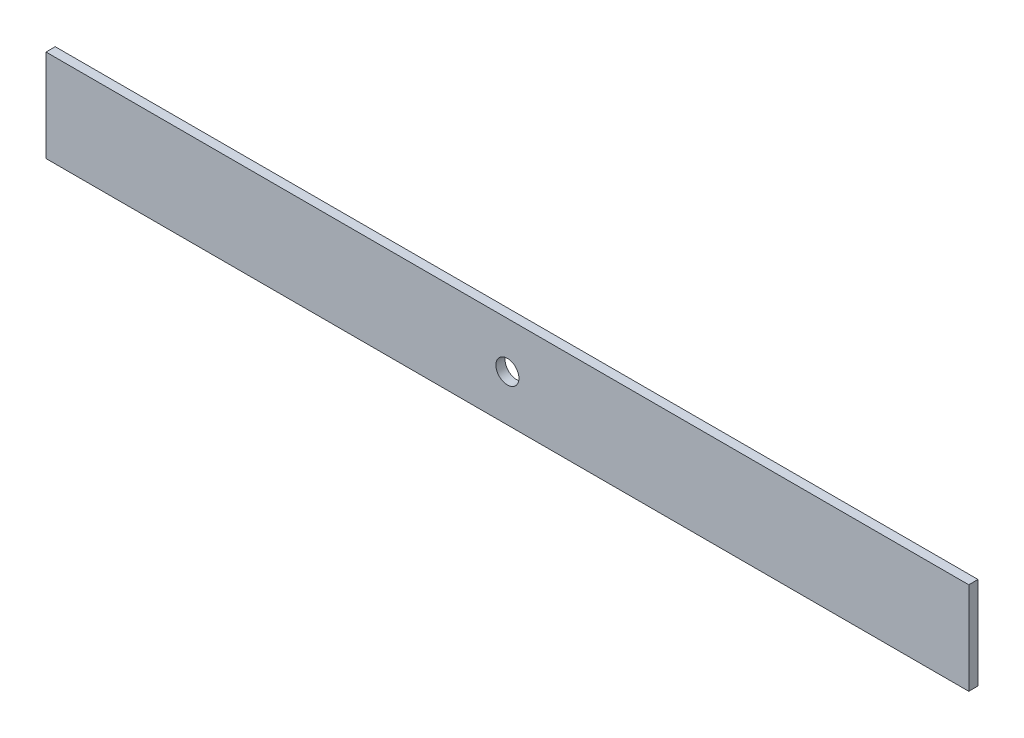
ISO-10303-21;
HEADER;
FILE_DESCRIPTION(('STEP AP214'),'2;1');
FILE_NAME('part.step','',(''),(''),'','','');
FILE_SCHEMA(('AUTOMOTIVE_DESIGN { 1 0 10303 214 1 1 1 1 }'));
ENDSEC;
DATA;
#1=APPLICATION_CONTEXT('core data for automotive mechanical design processes');
#2=APPLICATION_PROTOCOL_DEFINITION('international standard','automotive_design',2000,#1);
#3=PRODUCT_CONTEXT('',#1,'mechanical');
#4=PRODUCT('Part','Part','',(#3));
#5=PRODUCT_RELATED_PRODUCT_CATEGORY('part','',(#4));
#6=PRODUCT_DEFINITION_FORMATION('','',#4);
#7=PRODUCT_DEFINITION_CONTEXT('part definition',#1,'design');
#8=PRODUCT_DEFINITION('design','',#6,#7);
#9=PRODUCT_DEFINITION_SHAPE('','',#8);
#10=(LENGTH_UNIT() NAMED_UNIT(*) SI_UNIT(.MILLI.,.METRE.));
#11=(NAMED_UNIT(*) PLANE_ANGLE_UNIT() SI_UNIT($,.RADIAN.));
#12=(NAMED_UNIT(*) SI_UNIT($,.STERADIAN.) SOLID_ANGLE_UNIT());
#13=UNCERTAINTY_MEASURE_WITH_UNIT(LENGTH_MEASURE(1.E-05),#10,'distance_accuracy_value','');
#14=(GEOMETRIC_REPRESENTATION_CONTEXT(3) GLOBAL_UNCERTAINTY_ASSIGNED_CONTEXT((#13)) GLOBAL_UNIT_ASSIGNED_CONTEXT((#10,
#11,#12)) REPRESENTATION_CONTEXT('',''));
#15=CARTESIAN_POINT('',(0.,0.,0.));
#16=DIRECTION('',(0.,0.,1.));
#17=DIRECTION('',(1.,0.,0.));
#18=AXIS2_PLACEMENT_3D('',#15,#16,#17);
#19=CARTESIAN_POINT('',(0.,0.,2.54));
#20=DIRECTION('',(0.,0.,-1.));
#21=DIRECTION('',(-1.,0.,0.));
#22=AXIS2_PLACEMENT_3D('',#19,#20,#21);
#23=PLANE('',#22);
#24=DIRECTION('',(0.,1.,0.));
#25=VECTOR('',#24,1.);
#26=CARTESIAN_POINT('',(127.,12.7,2.54));
#27=LINE('',#26,#25);
#28=CARTESIAN_POINT('',(127.,-12.7,2.54));
#29=VERTEX_POINT('',#28);
#30=CARTESIAN_POINT('',(127.,12.7,2.54));
#31=VERTEX_POINT('',#30);
#32=EDGE_CURVE('E85',#29,#31,#27,.T.);
#33=ORIENTED_EDGE('',*,*,#32,.T.);
#34=DIRECTION('',(-1.,0.,0.));
#35=VECTOR('',#34,1.);
#36=CARTESIAN_POINT('',(127.,12.7,2.54));
#37=LINE('',#36,#35);
#38=CARTESIAN_POINT('',(-127.,12.7,2.54));
#39=VERTEX_POINT('',#38);
#40=EDGE_CURVE('E80',#31,#39,#37,.T.);
#41=ORIENTED_EDGE('',*,*,#40,.T.);
#42=DIRECTION('',(0.,-1.,0.));
#43=VECTOR('',#42,1.);
#44=CARTESIAN_POINT('',(-127.,12.7,2.54));
#45=LINE('',#44,#43);
#46=CARTESIAN_POINT('',(-127.,-12.7,2.54));
#47=VERTEX_POINT('',#46);
#48=EDGE_CURVE('E83',#39,#47,#45,.T.);
#49=ORIENTED_EDGE('',*,*,#48,.T.);
#50=DIRECTION('',(1.,0.,0.));
#51=VECTOR('',#50,1.);
#52=CARTESIAN_POINT('',(127.,-12.7,2.54));
#53=LINE('',#52,#51);
#54=EDGE_CURVE('E50',#47,#29,#53,.T.);
#55=ORIENTED_EDGE('',*,*,#54,.T.);
#56=EDGE_LOOP('',(#33,#41,#49,#55));
#57=FACE_BOUND('',#56,.T.);
#58=CARTESIAN_POINT('',(0.,0.,2.54));
#59=DIRECTION('',(0.,0.,1.));
#60=DIRECTION('',(1.,0.,0.));
#61=AXIS2_PLACEMENT_3D('',#58,#59,#60);
#62=CIRCLE('',#61,3.175);
#63=CARTESIAN_POINT('',(3.175,0.,2.54));
#64=VERTEX_POINT('',#63);
#65=EDGE_CURVE('E100',#64,#64,#62,.T.);
#66=ORIENTED_EDGE('',*,*,#65,.F.);
#67=EDGE_LOOP('',(#66));
#68=FACE_BOUND('',#67,.T.);
#69=ADVANCED_FACE('F33',(#57,#68),#23,.F.);
#70=CARTESIAN_POINT('',(0.,0.,0.));
#71=DIRECTION('',(0.,0.,-1.));
#72=DIRECTION('',(-1.,0.,0.));
#73=AXIS2_PLACEMENT_3D('',#70,#71,#72);
#74=PLANE('',#73);
#75=DIRECTION('',(0.,1.,0.));
#76=VECTOR('',#75,1.);
#77=CARTESIAN_POINT('',(127.,12.7,0.));
#78=LINE('',#77,#76);
#79=CARTESIAN_POINT('',(127.,-12.7,0.));
#80=VERTEX_POINT('',#79);
#81=CARTESIAN_POINT('',(127.,12.7,0.));
#82=VERTEX_POINT('',#81);
#83=EDGE_CURVE('E97',#80,#82,#78,.T.);
#84=ORIENTED_EDGE('',*,*,#83,.F.);
#85=DIRECTION('',(1.,0.,0.));
#86=VECTOR('',#85,1.);
#87=CARTESIAN_POINT('',(127.,-12.7,0.));
#88=LINE('',#87,#86);
#89=CARTESIAN_POINT('',(-127.,-12.7,0.));
#90=VERTEX_POINT('',#89);
#91=EDGE_CURVE('E73',#90,#80,#88,.T.);
#92=ORIENTED_EDGE('',*,*,#91,.F.);
#93=DIRECTION('',(0.,-1.,0.));
#94=VECTOR('',#93,1.);
#95=CARTESIAN_POINT('',(-127.,12.7,0.));
#96=LINE('',#95,#94);
#97=CARTESIAN_POINT('',(-127.,12.7,0.));
#98=VERTEX_POINT('',#97);
#99=EDGE_CURVE('E67',#98,#90,#96,.T.);
#100=ORIENTED_EDGE('',*,*,#99,.F.);
#101=DIRECTION('',(-1.,0.,0.));
#102=VECTOR('',#101,1.);
#103=CARTESIAN_POINT('',(127.,12.7,0.));
#104=LINE('',#103,#102);
#105=EDGE_CURVE('E89',#82,#98,#104,.T.);
#106=ORIENTED_EDGE('',*,*,#105,.F.);
#107=EDGE_LOOP('',(#84,#92,#100,#106));
#108=FACE_BOUND('',#107,.T.);
#109=CARTESIAN_POINT('',(0.,0.,0.));
#110=DIRECTION('',(0.,0.,1.));
#111=DIRECTION('',(1.,0.,0.));
#112=AXIS2_PLACEMENT_3D('',#109,#110,#111);
#113=CIRCLE('',#112,3.175);
#114=CARTESIAN_POINT('',(3.175,0.,0.));
#115=VERTEX_POINT('',#114);
#116=EDGE_CURVE('E112',#115,#115,#113,.T.);
#117=ORIENTED_EDGE('',*,*,#116,.T.);
#118=EDGE_LOOP('',(#117));
#119=FACE_BOUND('',#118,.T.);
#120=ADVANCED_FACE('F108',(#108,#119),#74,.T.);
#121=CARTESIAN_POINT('',(127.,12.7,2.54));
#122=DIRECTION('',(-1.,0.,0.));
#123=DIRECTION('',(0.,0.,1.));
#124=AXIS2_PLACEMENT_3D('',#121,#122,#123);
#125=PLANE('',#124);
#126=ORIENTED_EDGE('',*,*,#83,.T.);
#127=DIRECTION('',(0.,0.,-1.));
#128=VECTOR('',#127,1.);
#129=CARTESIAN_POINT('',(127.,12.7,2.54));
#130=LINE('',#129,#128);
#131=EDGE_CURVE('E11',#31,#82,#130,.T.);
#132=ORIENTED_EDGE('',*,*,#131,.F.);
#133=ORIENTED_EDGE('',*,*,#32,.F.);
#134=DIRECTION('',(0.,0.,-1.));
#135=VECTOR('',#134,1.);
#136=CARTESIAN_POINT('',(127.,-12.7,2.54));
#137=LINE('',#136,#135);
#138=EDGE_CURVE('E93',#29,#80,#137,.T.);
#139=ORIENTED_EDGE('',*,*,#138,.T.);
#140=EDGE_LOOP('',(#126,#132,#133,#139));
#141=FACE_BOUND('',#140,.T.);
#142=ADVANCED_FACE('F35',(#141),#125,.F.);
#143=CARTESIAN_POINT('',(127.,12.7,2.54));
#144=DIRECTION('',(0.,-1.,0.));
#145=DIRECTION('',(1.,0.,0.));
#146=AXIS2_PLACEMENT_3D('',#143,#144,#145);
#147=PLANE('',#146);
#148=ORIENTED_EDGE('',*,*,#105,.T.);
#149=DIRECTION('',(0.,0.,-1.));
#150=VECTOR('',#149,1.);
#151=CARTESIAN_POINT('',(-127.,12.7,2.54));
#152=LINE('',#151,#150);
#153=EDGE_CURVE('E42',#39,#98,#152,.T.);
#154=ORIENTED_EDGE('',*,*,#153,.F.);
#155=ORIENTED_EDGE('',*,*,#40,.F.);
#156=ORIENTED_EDGE('',*,*,#131,.T.);
#157=EDGE_LOOP('',(#148,#154,#155,#156));
#158=FACE_BOUND('',#157,.T.);
#159=ADVANCED_FACE('F88',(#158),#147,.F.);
#160=CARTESIAN_POINT('',(-127.,12.7,2.54));
#161=DIRECTION('',(1.,0.,0.));
#162=DIRECTION('',(0.,0.,-1.));
#163=AXIS2_PLACEMENT_3D('',#160,#161,#162);
#164=PLANE('',#163);
#165=ORIENTED_EDGE('',*,*,#99,.T.);
#166=DIRECTION('',(0.,0.,-1.));
#167=VECTOR('',#166,1.);
#168=CARTESIAN_POINT('',(-127.,-12.7,2.54));
#169=LINE('',#168,#167);
#170=EDGE_CURVE('E90',#47,#90,#169,.T.);
#171=ORIENTED_EDGE('',*,*,#170,.F.);
#172=ORIENTED_EDGE('',*,*,#48,.F.);
#173=ORIENTED_EDGE('',*,*,#153,.T.);
#174=EDGE_LOOP('',(#165,#171,#172,#173));
#175=FACE_BOUND('',#174,.T.);
#176=ADVANCED_FACE('F91',(#175),#164,.F.);
#177=CARTESIAN_POINT('',(127.,-12.7,2.54));
#178=DIRECTION('',(0.,1.,0.));
#179=DIRECTION('',(-1.,0.,0.));
#180=AXIS2_PLACEMENT_3D('',#177,#178,#179);
#181=PLANE('',#180);
#182=ORIENTED_EDGE('',*,*,#91,.T.);
#183=ORIENTED_EDGE('',*,*,#138,.F.);
#184=ORIENTED_EDGE('',*,*,#54,.F.);
#185=ORIENTED_EDGE('',*,*,#170,.T.);
#186=EDGE_LOOP('',(#182,#183,#184,#185));
#187=FACE_BOUND('',#186,.T.);
#188=ADVANCED_FACE('F105',(#187),#181,.F.);
#189=CARTESIAN_POINT('',(0.,0.,2.54));
#190=DIRECTION('',(0.,0.,-1.));
#191=DIRECTION('',(-1.,0.,0.));
#192=AXIS2_PLACEMENT_3D('',#189,#190,#191);
#193=CYLINDRICAL_SURFACE('',#192,3.175);
#194=ORIENTED_EDGE('',*,*,#65,.T.);
#195=EDGE_LOOP('',(#194));
#196=FACE_BOUND('',#195,.T.);
#197=ORIENTED_EDGE('',*,*,#116,.F.);
#198=EDGE_LOOP('',(#197));
#199=FACE_BOUND('',#198,.T.);
#200=ADVANCED_FACE('F118',(#196,#199),#193,.F.);
#201=CLOSED_SHELL('',(#69,#120,#142,#159,#176,#188,#200));
#202=MANIFOLD_SOLID_BREP('B2',#201);
#203=ADVANCED_BREP_SHAPE_REPRESENTATION('',(#18,#202),#14);
#204=SHAPE_DEFINITION_REPRESENTATION(#9,#203);
ENDSEC;
END-ISO-10303-21;
